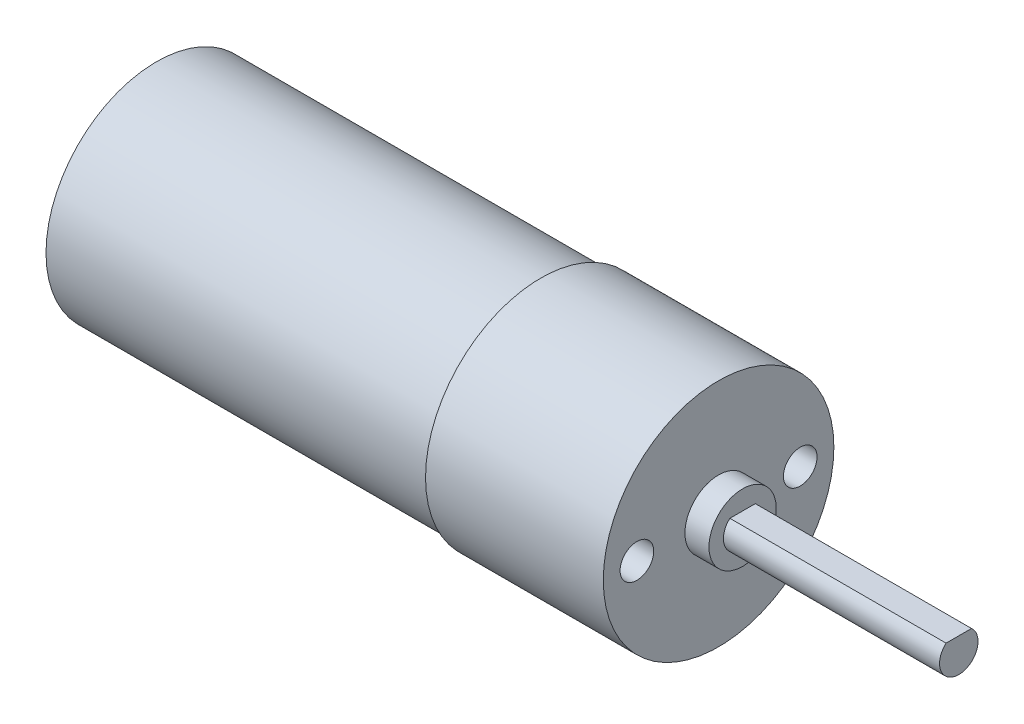
ISO-10303-21;
HEADER;
FILE_DESCRIPTION(('STEP AP214'),'2;1');
FILE_NAME('part.step','',(''),(''),'','','');
FILE_SCHEMA(('AUTOMOTIVE_DESIGN { 1 0 10303 214 1 1 1 1 }'));
ENDSEC;
DATA;
#1=APPLICATION_CONTEXT('core data for automotive mechanical design processes');
#2=APPLICATION_PROTOCOL_DEFINITION('international standard','automotive_design',2000,#1);
#3=PRODUCT_CONTEXT('',#1,'mechanical');
#4=PRODUCT('Part','Part','',(#3));
#5=PRODUCT_RELATED_PRODUCT_CATEGORY('part','',(#4));
#6=PRODUCT_DEFINITION_FORMATION('','',#4);
#7=PRODUCT_DEFINITION_CONTEXT('part definition',#1,'design');
#8=PRODUCT_DEFINITION('design','',#6,#7);
#9=PRODUCT_DEFINITION_SHAPE('','',#8);
#10=(LENGTH_UNIT() NAMED_UNIT(*) SI_UNIT(.MILLI.,.METRE.));
#11=(NAMED_UNIT(*) PLANE_ANGLE_UNIT() SI_UNIT($,.RADIAN.));
#12=(NAMED_UNIT(*) SI_UNIT($,.STERADIAN.) SOLID_ANGLE_UNIT());
#13=UNCERTAINTY_MEASURE_WITH_UNIT(LENGTH_MEASURE(1.E-05),#10,'distance_accuracy_value','');
#14=(GEOMETRIC_REPRESENTATION_CONTEXT(3) GLOBAL_UNCERTAINTY_ASSIGNED_CONTEXT((#13)) GLOBAL_UNIT_ASSIGNED_CONTEXT((#10,
#11,#12)) REPRESENTATION_CONTEXT('',''));
#15=CARTESIAN_POINT('',(0.,0.,0.));
#16=DIRECTION('',(0.,0.,1.));
#17=DIRECTION('',(1.,0.,0.));
#18=AXIS2_PLACEMENT_3D('',#15,#16,#17);
#19=CARTESIAN_POINT('',(-83.5,0.,0.));
#20=DIRECTION('',(-1.,0.,0.));
#21=DIRECTION('',(0.,0.,1.));
#22=AXIS2_PLACEMENT_3D('',#19,#20,#21);
#23=CYLINDRICAL_SURFACE('',#22,12.);
#24=CARTESIAN_POINT('',(-25.,0.,0.));
#25=DIRECTION('',(-1.,0.,0.));
#26=DIRECTION('',(0.,0.,1.));
#27=AXIS2_PLACEMENT_3D('',#24,#25,#26);
#28=CIRCLE('',#27,12.);
#29=CARTESIAN_POINT('',(-25.,0.,12.));
#30=VERTEX_POINT('',#29);
#31=EDGE_CURVE('E68',#30,#30,#28,.T.);
#32=ORIENTED_EDGE('',*,*,#31,.T.);
#33=EDGE_LOOP('',(#32));
#34=FACE_BOUND('',#33,.T.);
#35=CARTESIAN_POINT('',(-43.5,0.,0.));
#36=DIRECTION('',(-1.,0.,0.));
#37=DIRECTION('',(0.,0.,1.));
#38=AXIS2_PLACEMENT_3D('',#35,#36,#37);
#39=CIRCLE('',#38,12.);
#40=CARTESIAN_POINT('',(-43.5,0.,12.));
#41=VERTEX_POINT('',#40);
#42=EDGE_CURVE('E87',#41,#41,#39,.T.);
#43=ORIENTED_EDGE('',*,*,#42,.F.);
#44=EDGE_LOOP('',(#43));
#45=FACE_BOUND('',#44,.T.);
#46=ADVANCED_FACE('F33',(#34,#45),#23,.T.);
#47=CARTESIAN_POINT('',(0.,0.,0.));
#48=DIRECTION('',(-1.,0.,0.));
#49=DIRECTION('',(0.,0.,1.));
#50=AXIS2_PLACEMENT_3D('',#47,#48,#49);
#51=PLANE('',#50);
#52=CARTESIAN_POINT('',(0.,0.,0.));
#53=DIRECTION('',(-1.,0.,0.));
#54=DIRECTION('',(0.,0.,1.));
#55=AXIS2_PLACEMENT_3D('',#52,#53,#54);
#56=CIRCLE('',#55,2.);
#57=CARTESIAN_POINT('',(0.,1.5,-1.32287565553229));
#58=VERTEX_POINT('',#57);
#59=CARTESIAN_POINT('',(0.,1.5,1.32287565553229));
#60=VERTEX_POINT('',#59);
#61=EDGE_CURVE('E11',#58,#60,#56,.T.);
#62=ORIENTED_EDGE('',*,*,#61,.F.);
#63=DIRECTION('',(0.,0.,-1.));
#64=VECTOR('',#63,1.);
#65=CARTESIAN_POINT('',(0.,1.5,-1.32287565553229));
#66=LINE('',#65,#64);
#67=EDGE_CURVE('E63',#60,#58,#66,.T.);
#68=ORIENTED_EDGE('',*,*,#67,.F.);
#69=EDGE_LOOP('',(#62,#68));
#70=FACE_BOUND('',#69,.T.);
#71=ADVANCED_FACE('F35',(#70),#51,.F.);
#72=CARTESIAN_POINT('',(-83.5,0.,0.));
#73=DIRECTION('',(-1.,0.,0.));
#74=DIRECTION('',(0.,0.,1.));
#75=AXIS2_PLACEMENT_3D('',#72,#73,#74);
#76=CYLINDRICAL_SURFACE('',#75,2.);
#77=ORIENTED_EDGE('',*,*,#61,.T.);
#78=DIRECTION('',(1.,0.,0.));
#79=VECTOR('',#78,1.);
#80=CARTESIAN_POINT('',(-25.1925824035673,1.5,1.32287565553229));
#81=LINE('',#80,#79);
#82=CARTESIAN_POINT('',(-22.5,1.5,1.32287565553229));
#83=VERTEX_POINT('',#82);
#84=EDGE_CURVE('E55',#83,#60,#81,.T.);
#85=ORIENTED_EDGE('',*,*,#84,.F.);
#86=CARTESIAN_POINT('',(-22.5,0.,0.));
#87=DIRECTION('',(-1.,0.,0.));
#88=DIRECTION('',(0.,0.,1.));
#89=AXIS2_PLACEMENT_3D('',#86,#87,#88);
#90=CIRCLE('',#89,2.);
#91=CARTESIAN_POINT('',(-22.5,1.5,-1.32287565553229));
#92=VERTEX_POINT('',#91);
#93=EDGE_CURVE('E41',#92,#83,#90,.T.);
#94=ORIENTED_EDGE('',*,*,#93,.F.);
#95=DIRECTION('',(1.,0.,0.));
#96=VECTOR('',#95,1.);
#97=CARTESIAN_POINT('',(-25.1925824035673,1.5,-1.32287565553229));
#98=LINE('',#97,#96);
#99=EDGE_CURVE('E61',#92,#58,#98,.T.);
#100=ORIENTED_EDGE('',*,*,#99,.T.);
#101=EDGE_LOOP('',(#77,#85,#94,#100));
#102=FACE_BOUND('',#101,.T.);
#103=ADVANCED_FACE('F66',(#102),#76,.T.);
#104=CARTESIAN_POINT('',(-22.5,0.,-2.));
#105=DIRECTION('',(-1.,0.,0.));
#106=DIRECTION('',(0.,0.,1.));
#107=AXIS2_PLACEMENT_3D('',#104,#105,#106);
#108=PLANE('',#107);
#109=CARTESIAN_POINT('',(-22.5,0.,0.));
#110=DIRECTION('',(-1.,0.,0.));
#111=DIRECTION('',(0.,0.,1.));
#112=AXIS2_PLACEMENT_3D('',#109,#110,#111);
#113=CIRCLE('',#112,3.5);
#114=CARTESIAN_POINT('',(-22.5,0.,3.5));
#115=VERTEX_POINT('',#114);
#116=EDGE_CURVE('E71',#115,#115,#113,.T.);
#117=ORIENTED_EDGE('',*,*,#116,.F.);
#118=EDGE_LOOP('',(#117));
#119=FACE_BOUND('',#118,.T.);
#120=ORIENTED_EDGE('',*,*,#93,.T.);
#121=DIRECTION('',(0.,0.,-1.));
#122=VECTOR('',#121,1.);
#123=CARTESIAN_POINT('',(-22.5,1.5,-1.32287565553229));
#124=LINE('',#123,#122);
#125=EDGE_CURVE('E47',#83,#92,#124,.T.);
#126=ORIENTED_EDGE('',*,*,#125,.T.);
#127=EDGE_LOOP('',(#120,#126));
#128=FACE_BOUND('',#127,.T.);
#129=ADVANCED_FACE('F70',(#119,#128),#108,.F.);
#130=CARTESIAN_POINT('',(-83.5,0.,0.));
#131=DIRECTION('',(-1.,0.,0.));
#132=DIRECTION('',(0.,0.,1.));
#133=AXIS2_PLACEMENT_3D('',#130,#131,#132);
#134=CYLINDRICAL_SURFACE('',#133,3.5);
#135=CARTESIAN_POINT('',(-25.,0.,0.));
#136=DIRECTION('',(-1.,0.,0.));
#137=DIRECTION('',(0.,0.,1.));
#138=AXIS2_PLACEMENT_3D('',#135,#136,#137);
#139=CIRCLE('',#138,3.5);
#140=CARTESIAN_POINT('',(-25.,0.,3.5));
#141=VERTEX_POINT('',#140);
#142=EDGE_CURVE('E73',#141,#141,#139,.T.);
#143=ORIENTED_EDGE('',*,*,#142,.F.);
#144=EDGE_LOOP('',(#143));
#145=FACE_BOUND('',#144,.T.);
#146=ORIENTED_EDGE('',*,*,#116,.T.);
#147=EDGE_LOOP('',(#146));
#148=FACE_BOUND('',#147,.T.);
#149=ADVANCED_FACE('F128',(#145,#148),#134,.T.);
#150=CARTESIAN_POINT('',(-25.,0.,-3.5));
#151=DIRECTION('',(-1.,0.,0.));
#152=DIRECTION('',(0.,0.,1.));
#153=AXIS2_PLACEMENT_3D('',#150,#151,#152);
#154=PLANE('',#153);
#155=CARTESIAN_POINT('',(-25.,0.,8.5));
#156=DIRECTION('',(1.,0.,0.));
#157=DIRECTION('',(0.,0.,-1.));
#158=AXIS2_PLACEMENT_3D('',#155,#156,#157);
#159=CIRCLE('',#158,1.75);
#160=CARTESIAN_POINT('',(-25.,0.,6.75));
#161=VERTEX_POINT('',#160);
#162=EDGE_CURVE('E90',#161,#161,#159,.T.);
#163=ORIENTED_EDGE('',*,*,#162,.F.);
#164=EDGE_LOOP('',(#163));
#165=FACE_BOUND('',#164,.T.);
#166=CARTESIAN_POINT('',(-25.,2.13370987545147E-13,-8.5));
#167=DIRECTION('',(1.,0.,0.));
#168=DIRECTION('',(0.,0.,-1.));
#169=AXIS2_PLACEMENT_3D('',#166,#167,#168);
#170=CIRCLE('',#169,1.75);
#171=CARTESIAN_POINT('',(-25.,2.13370987545147E-13,-10.25));
#172=VERTEX_POINT('',#171);
#173=EDGE_CURVE('E83',#172,#172,#170,.T.);
#174=ORIENTED_EDGE('',*,*,#173,.F.);
#175=EDGE_LOOP('',(#174));
#176=FACE_BOUND('',#175,.T.);
#177=ORIENTED_EDGE('',*,*,#31,.F.);
#178=EDGE_LOOP('',(#177));
#179=FACE_BOUND('',#178,.T.);
#180=ORIENTED_EDGE('',*,*,#142,.T.);
#181=EDGE_LOOP('',(#180));
#182=FACE_BOUND('',#181,.T.);
#183=ADVANCED_FACE('F125',(#165,#176,#179,#182),#154,.F.);
#184=CARTESIAN_POINT('',(-25.1925824035673,1.5,-1.32287565553229));
#185=DIRECTION('',(0.,-1.,0.));
#186=DIRECTION('',(0.,0.,-1.));
#187=AXIS2_PLACEMENT_3D('',#184,#185,#186);
#188=PLANE('',#187);
#189=ORIENTED_EDGE('',*,*,#84,.T.);
#190=ORIENTED_EDGE('',*,*,#67,.T.);
#191=ORIENTED_EDGE('',*,*,#99,.F.);
#192=ORIENTED_EDGE('',*,*,#125,.F.);
#193=EDGE_LOOP('',(#189,#190,#191,#192));
#194=FACE_BOUND('',#193,.T.);
#195=ADVANCED_FACE('F59',(#194),#188,.F.);
#196=CARTESIAN_POINT('',(-30.,2.13370987545147E-13,-8.5));
#197=DIRECTION('',(1.,0.,0.));
#198=DIRECTION('',(0.,0.,-1.));
#199=AXIS2_PLACEMENT_3D('',#196,#197,#198);
#200=CYLINDRICAL_SURFACE('',#199,1.75);
#201=CARTESIAN_POINT('',(-30.,2.13370987545147E-13,-8.5));
#202=DIRECTION('',(1.,0.,0.));
#203=DIRECTION('',(0.,0.,-1.));
#204=AXIS2_PLACEMENT_3D('',#201,#202,#203);
#205=CIRCLE('',#204,1.75);
#206=CARTESIAN_POINT('',(-30.,2.13370987545147E-13,-10.25));
#207=VERTEX_POINT('',#206);
#208=EDGE_CURVE('E86',#207,#207,#205,.T.);
#209=ORIENTED_EDGE('',*,*,#208,.F.);
#210=EDGE_LOOP('',(#209));
#211=FACE_BOUND('',#210,.T.);
#212=ORIENTED_EDGE('',*,*,#173,.T.);
#213=EDGE_LOOP('',(#212));
#214=FACE_BOUND('',#213,.T.);
#215=ADVANCED_FACE('F159',(#211,#214),#200,.F.);
#216=CARTESIAN_POINT('',(-30.,2.13370987545147E-13,-8.5));
#217=DIRECTION('',(1.,0.,0.));
#218=DIRECTION('',(0.,0.,-1.));
#219=AXIS2_PLACEMENT_3D('',#216,#217,#218);
#220=PLANE('',#219);
#221=ORIENTED_EDGE('',*,*,#208,.T.);
#222=EDGE_LOOP('',(#221));
#223=FACE_BOUND('',#222,.T.);
#224=ADVANCED_FACE('F164',(#223),#220,.T.);
#225=CARTESIAN_POINT('',(-30.,0.,8.5));
#226=DIRECTION('',(1.,0.,0.));
#227=DIRECTION('',(0.,0.,-1.));
#228=AXIS2_PLACEMENT_3D('',#225,#226,#227);
#229=CYLINDRICAL_SURFACE('',#228,1.75);
#230=CARTESIAN_POINT('',(-30.,0.,8.5));
#231=DIRECTION('',(1.,0.,0.));
#232=DIRECTION('',(0.,0.,-1.));
#233=AXIS2_PLACEMENT_3D('',#230,#231,#232);
#234=CIRCLE('',#233,1.75);
#235=CARTESIAN_POINT('',(-30.,0.,6.75));
#236=VERTEX_POINT('',#235);
#237=EDGE_CURVE('E82',#236,#236,#234,.T.);
#238=ORIENTED_EDGE('',*,*,#237,.F.);
#239=EDGE_LOOP('',(#238));
#240=FACE_BOUND('',#239,.T.);
#241=ORIENTED_EDGE('',*,*,#162,.T.);
#242=EDGE_LOOP('',(#241));
#243=FACE_BOUND('',#242,.T.);
#244=ADVANCED_FACE('F172',(#240,#243),#229,.F.);
#245=CARTESIAN_POINT('',(-30.,0.,8.5));
#246=DIRECTION('',(1.,0.,0.));
#247=DIRECTION('',(0.,0.,-1.));
#248=AXIS2_PLACEMENT_3D('',#245,#246,#247);
#249=PLANE('',#248);
#250=ORIENTED_EDGE('',*,*,#237,.T.);
#251=EDGE_LOOP('',(#250));
#252=FACE_BOUND('',#251,.T.);
#253=ADVANCED_FACE('F110',(#252),#249,.T.);
#254=CARTESIAN_POINT('',(-43.5,0.,0.));
#255=DIRECTION('',(-1.,0.,0.));
#256=DIRECTION('',(0.,0.,1.));
#257=AXIS2_PLACEMENT_3D('',#254,#255,#256);
#258=PLANE('',#257);
#259=CARTESIAN_POINT('',(-43.5,0.,0.));
#260=DIRECTION('',(-1.,0.,0.));
#261=DIRECTION('',(0.,0.,1.));
#262=AXIS2_PLACEMENT_3D('',#259,#260,#261);
#263=CIRCLE('',#262,11.5);
#264=CARTESIAN_POINT('',(-43.5,0.,11.5));
#265=VERTEX_POINT('',#264);
#266=EDGE_CURVE('E97',#265,#265,#263,.T.);
#267=ORIENTED_EDGE('',*,*,#266,.F.);
#268=EDGE_LOOP('',(#267));
#269=FACE_BOUND('',#268,.T.);
#270=ORIENTED_EDGE('',*,*,#42,.T.);
#271=EDGE_LOOP('',(#270));
#272=FACE_BOUND('',#271,.T.);
#273=ADVANCED_FACE('F107',(#269,#272),#258,.T.);
#274=CARTESIAN_POINT('',(-43.5,0.,0.));
#275=DIRECTION('',(-1.,0.,0.));
#276=DIRECTION('',(0.,0.,1.));
#277=AXIS2_PLACEMENT_3D('',#274,#275,#276);
#278=CYLINDRICAL_SURFACE('',#277,11.5);
#279=ORIENTED_EDGE('',*,*,#266,.T.);
#280=EDGE_LOOP('',(#279));
#281=FACE_BOUND('',#280,.T.);
#282=CARTESIAN_POINT('',(-83.5,0.,0.));
#283=DIRECTION('',(-1.,0.,0.));
#284=DIRECTION('',(0.,0.,1.));
#285=AXIS2_PLACEMENT_3D('',#282,#283,#284);
#286=CIRCLE('',#285,11.5);
#287=CARTESIAN_POINT('',(-83.5,0.,11.5));
#288=VERTEX_POINT('',#287);
#289=EDGE_CURVE('E98',#288,#288,#286,.T.);
#290=ORIENTED_EDGE('',*,*,#289,.F.);
#291=EDGE_LOOP('',(#290));
#292=FACE_BOUND('',#291,.T.);
#293=ADVANCED_FACE('F104',(#281,#292),#278,.T.);
#294=CARTESIAN_POINT('',(-83.5,0.,-12.));
#295=DIRECTION('',(1.,0.,0.));
#296=DIRECTION('',(0.,0.,-1.));
#297=AXIS2_PLACEMENT_3D('',#294,#295,#296);
#298=PLANE('',#297);
#299=ORIENTED_EDGE('',*,*,#289,.T.);
#300=EDGE_LOOP('',(#299));
#301=FACE_BOUND('',#300,.T.);
#302=ADVANCED_FACE('F123',(#301),#298,.F.);
#303=CLOSED_SHELL('',(#46,#71,#103,#129,#149,#183,#195,#215,#224,#244,#253,#273,#293,#302));
#304=MANIFOLD_SOLID_BREP('B2',#303);
#305=ADVANCED_BREP_SHAPE_REPRESENTATION('',(#18,#304),#14);
#306=SHAPE_DEFINITION_REPRESENTATION(#9,#305);
ENDSEC;
END-ISO-10303-21;
